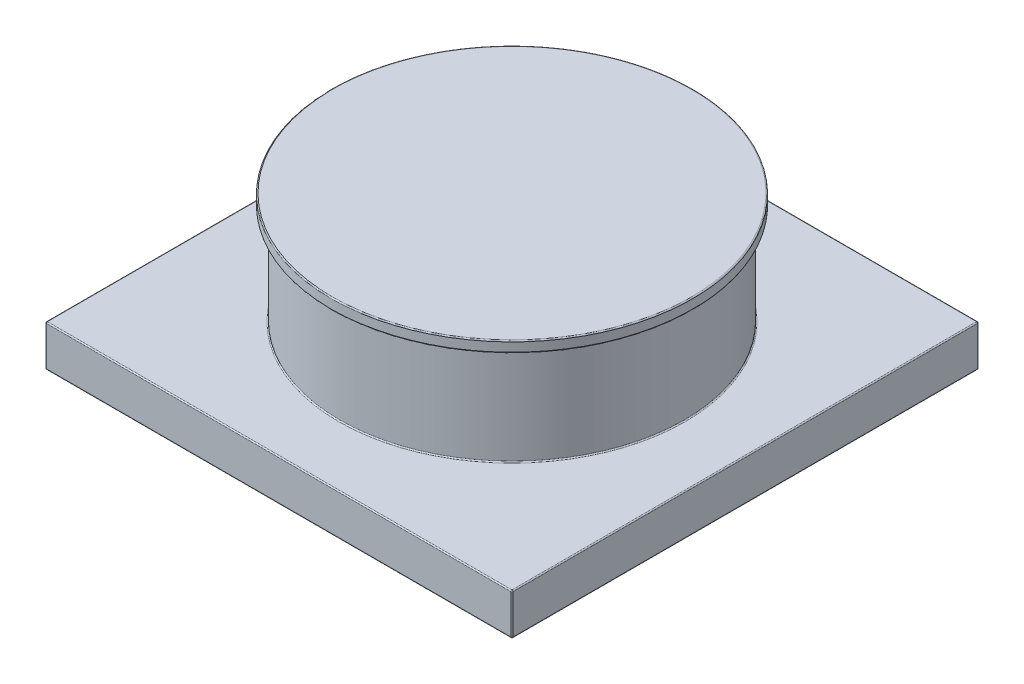
ISO-10303-21;
HEADER;
FILE_DESCRIPTION(('STEP AP214'),'2;1');
FILE_NAME('part.step','',(''),(''),'','','');
FILE_SCHEMA(('AUTOMOTIVE_DESIGN { 1 0 10303 214 1 1 1 1 }'));
ENDSEC;
DATA;
#1=APPLICATION_CONTEXT('core data for automotive mechanical design processes');
#2=APPLICATION_PROTOCOL_DEFINITION('international standard','automotive_design',2000,#1);
#3=PRODUCT_CONTEXT('',#1,'mechanical');
#4=PRODUCT('Part','Part','',(#3));
#5=PRODUCT_RELATED_PRODUCT_CATEGORY('part','',(#4));
#6=PRODUCT_DEFINITION_FORMATION('','',#4);
#7=PRODUCT_DEFINITION_CONTEXT('part definition',#1,'design');
#8=PRODUCT_DEFINITION('design','',#6,#7);
#9=PRODUCT_DEFINITION_SHAPE('','',#8);
#10=(LENGTH_UNIT() NAMED_UNIT(*) SI_UNIT(.MILLI.,.METRE.));
#11=(NAMED_UNIT(*) PLANE_ANGLE_UNIT() SI_UNIT($,.RADIAN.));
#12=(NAMED_UNIT(*) SI_UNIT($,.STERADIAN.) SOLID_ANGLE_UNIT());
#13=UNCERTAINTY_MEASURE_WITH_UNIT(LENGTH_MEASURE(1.E-05),#10,'distance_accuracy_value','');
#14=(GEOMETRIC_REPRESENTATION_CONTEXT(3) GLOBAL_UNCERTAINTY_ASSIGNED_CONTEXT((#13)) GLOBAL_UNIT_ASSIGNED_CONTEXT((#10,
#11,#12)) REPRESENTATION_CONTEXT('',''));
#15=CARTESIAN_POINT('',(0.,0.,0.));
#16=DIRECTION('',(0.,0.,1.));
#17=DIRECTION('',(1.,0.,0.));
#18=AXIS2_PLACEMENT_3D('',#15,#16,#17);
#19=CARTESIAN_POINT('',(1050.,687.,-1050.));
#20=DIRECTION('',(0.,-1.,0.));
#21=DIRECTION('',(0.,0.,-1.));
#22=AXIS2_PLACEMENT_3D('',#19,#20,#21);
#23=CYLINDRICAL_SURFACE('',#22,775.);
#24=CARTESIAN_POINT('',(1050.,191.,-1050.));
#25=DIRECTION('',(0.,-1.,0.));
#26=DIRECTION('',(0.,0.,-1.));
#27=AXIS2_PLACEMENT_3D('',#24,#25,#26);
#28=CIRCLE('',#27,775.);
#29=CARTESIAN_POINT('',(1050.,191.,-1825.));
#30=VERTEX_POINT('',#29);
#31=EDGE_CURVE('E284',#30,#30,#28,.F.);
#32=ORIENTED_EDGE('',*,*,#31,.T.);
#33=EDGE_LOOP('',(#32));
#34=FACE_BOUND('',#33,.T.);
#35=CARTESIAN_POINT('',(1050.,637.,-1050.));
#36=DIRECTION('',(0.,1.,0.));
#37=DIRECTION('',(0.,0.,1.));
#38=AXIS2_PLACEMENT_3D('',#35,#36,#37);
#39=CIRCLE('',#38,775.);
#40=CARTESIAN_POINT('',(1050.,637.,-275.));
#41=VERTEX_POINT('',#40);
#42=EDGE_CURVE('E148',#41,#41,#39,.T.);
#43=ORIENTED_EDGE('',*,*,#42,.F.);
#44=EDGE_LOOP('',(#43));
#45=FACE_BOUND('',#44,.T.);
#46=ADVANCED_FACE('F33',(#34,#45),#23,.T.);
#47=CARTESIAN_POINT('',(0.,186.,-2100.));
#48=DIRECTION('',(0.,-1.,0.));
#49=DIRECTION('',(0.,0.,-1.));
#50=AXIS2_PLACEMENT_3D('',#47,#48,#49);
#51=PLANE('',#50);
#52=DIRECTION('',(1.,0.,0.));
#53=VECTOR('',#52,1.);
#54=CARTESIAN_POINT('',(0.,186.,-4.99999999999989));
#55=LINE('',#54,#53);
#56=CARTESIAN_POINT('',(5.,186.,-4.99999999999989));
#57=VERTEX_POINT('',#56);
#58=CARTESIAN_POINT('',(2095.,186.,-4.99999999999989));
#59=VERTEX_POINT('',#58);
#60=EDGE_CURVE('E58',#57,#59,#55,.T.);
#61=ORIENTED_EDGE('',*,*,#60,.T.);
#62=DIRECTION('',(0.,0.,-1.));
#63=VECTOR('',#62,1.);
#64=CARTESIAN_POINT('',(2095.,186.,-2100.));
#65=LINE('',#64,#63);
#66=CARTESIAN_POINT('',(2095.,186.,-2095.));
#67=VERTEX_POINT('',#66);
#68=EDGE_CURVE('E282',#59,#67,#65,.T.);
#69=ORIENTED_EDGE('',*,*,#68,.T.);
#70=DIRECTION('',(-1.,0.,0.));
#71=VECTOR('',#70,1.);
#72=CARTESIAN_POINT('',(0.,186.,-2095.));
#73=LINE('',#72,#71);
#74=CARTESIAN_POINT('',(5.,186.,-2095.));
#75=VERTEX_POINT('',#74);
#76=EDGE_CURVE('E50',#67,#75,#73,.T.);
#77=ORIENTED_EDGE('',*,*,#76,.T.);
#78=DIRECTION('',(0.,0.,1.));
#79=VECTOR('',#78,1.);
#80=CARTESIAN_POINT('',(5.,186.,-2100.));
#81=LINE('',#80,#79);
#82=EDGE_CURVE('E278',#75,#57,#81,.T.);
#83=ORIENTED_EDGE('',*,*,#82,.T.);
#84=EDGE_LOOP('',(#61,#69,#77,#83));
#85=FACE_BOUND('',#84,.T.);
#86=CARTESIAN_POINT('',(1050.,186.,-1050.));
#87=DIRECTION('',(0.,-1.,0.));
#88=DIRECTION('',(0.,0.,-1.));
#89=AXIS2_PLACEMENT_3D('',#86,#87,#88);
#90=CIRCLE('',#89,780.);
#91=CARTESIAN_POINT('',(1050.,186.,-1830.));
#92=VERTEX_POINT('',#91);
#93=EDGE_CURVE('E275',#92,#92,#90,.T.);
#94=ORIENTED_EDGE('',*,*,#93,.T.);
#95=EDGE_LOOP('',(#94));
#96=FACE_BOUND('',#95,.T.);
#97=ADVANCED_FACE('F362',(#85,#96),#51,.F.);
#98=CARTESIAN_POINT('',(0.,186.,0.));
#99=DIRECTION('',(1.,0.,0.));
#100=DIRECTION('',(0.,0.,-1.));
#101=AXIS2_PLACEMENT_3D('',#98,#99,#100);
#102=PLANE('',#101);
#103=DIRECTION('',(0.,-1.,0.));
#104=VECTOR('',#103,1.);
#105=CARTESIAN_POINT('',(0.,186.,-2095.));
#106=LINE('',#105,#104);
#107=CARTESIAN_POINT('',(0.,181.,-2095.));
#108=VERTEX_POINT('',#107);
#109=CARTESIAN_POINT('',(0.,5.,-2095.));
#110=VERTEX_POINT('',#109);
#111=EDGE_CURVE('E136',#108,#110,#106,.T.);
#112=ORIENTED_EDGE('',*,*,#111,.T.);
#113=DIRECTION('',(0.,0.,1.));
#114=VECTOR('',#113,1.);
#115=CARTESIAN_POINT('',(0.,5.,0.));
#116=LINE('',#115,#114);
#117=CARTESIAN_POINT('',(0.,5.,-5.));
#118=VERTEX_POINT('',#117);
#119=EDGE_CURVE('E132',#110,#118,#116,.T.);
#120=ORIENTED_EDGE('',*,*,#119,.T.);
#121=DIRECTION('',(0.,-1.,0.));
#122=VECTOR('',#121,1.);
#123=CARTESIAN_POINT('',(0.,186.,-5.));
#124=LINE('',#123,#122);
#125=CARTESIAN_POINT('',(0.,181.,-5.));
#126=VERTEX_POINT('',#125);
#127=EDGE_CURVE('E126',#118,#126,#124,.F.);
#128=ORIENTED_EDGE('',*,*,#127,.T.);
#129=DIRECTION('',(0.,0.,1.));
#130=VECTOR('',#129,1.);
#131=CARTESIAN_POINT('',(0.,181.,0.));
#132=LINE('',#131,#130);
#133=EDGE_CURVE('E129',#126,#108,#132,.F.);
#134=ORIENTED_EDGE('',*,*,#133,.T.);
#135=EDGE_LOOP('',(#112,#120,#128,#134));
#136=FACE_BOUND('',#135,.T.);
#137=ADVANCED_FACE('F128',(#136),#102,.F.);
#138=CARTESIAN_POINT('',(0.,186.,0.));
#139=DIRECTION('',(0.,0.,-1.));
#140=DIRECTION('',(-1.,0.,0.));
#141=AXIS2_PLACEMENT_3D('',#138,#139,#140);
#142=PLANE('',#141);
#143=DIRECTION('',(1.,0.,0.));
#144=VECTOR('',#143,1.);
#145=CARTESIAN_POINT('',(0.,181.,0.));
#146=LINE('',#145,#144);
#147=CARTESIAN_POINT('',(2095.,181.,0.));
#148=VERTEX_POINT('',#147);
#149=CARTESIAN_POINT('',(5.,181.,0.));
#150=VERTEX_POINT('',#149);
#151=EDGE_CURVE('E250',#148,#150,#146,.F.);
#152=ORIENTED_EDGE('',*,*,#151,.T.);
#153=DIRECTION('',(0.,-1.,0.));
#154=VECTOR('',#153,1.);
#155=CARTESIAN_POINT('',(5.,186.,0.));
#156=LINE('',#155,#154);
#157=CARTESIAN_POINT('',(5.,5.,0.));
#158=VERTEX_POINT('',#157);
#159=EDGE_CURVE('E160',#150,#158,#156,.T.);
#160=ORIENTED_EDGE('',*,*,#159,.T.);
#161=DIRECTION('',(1.,0.,0.));
#162=VECTOR('',#161,1.);
#163=CARTESIAN_POINT('',(2100.,5.,0.));
#164=LINE('',#163,#162);
#165=CARTESIAN_POINT('',(2095.,5.,0.));
#166=VERTEX_POINT('',#165);
#167=EDGE_CURVE('E254',#158,#166,#164,.T.);
#168=ORIENTED_EDGE('',*,*,#167,.T.);
#169=DIRECTION('',(0.,-1.,0.));
#170=VECTOR('',#169,1.);
#171=CARTESIAN_POINT('',(2095.,186.,0.));
#172=LINE('',#171,#170);
#173=EDGE_CURVE('E252',#166,#148,#172,.F.);
#174=ORIENTED_EDGE('',*,*,#173,.T.);
#175=EDGE_LOOP('',(#152,#160,#168,#174));
#176=FACE_BOUND('',#175,.T.);
#177=ADVANCED_FACE('F335',(#176),#142,.F.);
#178=CARTESIAN_POINT('',(2100.,186.,0.));
#179=DIRECTION('',(-1.,0.,0.));
#180=DIRECTION('',(0.,0.,1.));
#181=AXIS2_PLACEMENT_3D('',#178,#179,#180);
#182=PLANE('',#181);
#183=DIRECTION('',(0.,0.,-1.));
#184=VECTOR('',#183,1.);
#185=CARTESIAN_POINT('',(2100.,5.,-2100.));
#186=LINE('',#185,#184);
#187=CARTESIAN_POINT('',(2100.,5.,-5.));
#188=VERTEX_POINT('',#187);
#189=CARTESIAN_POINT('',(2100.,5.,-2095.));
#190=VERTEX_POINT('',#189);
#191=EDGE_CURVE('E270',#188,#190,#186,.T.);
#192=ORIENTED_EDGE('',*,*,#191,.T.);
#193=DIRECTION('',(0.,-1.,0.));
#194=VECTOR('',#193,1.);
#195=CARTESIAN_POINT('',(2100.,186.,-2095.));
#196=LINE('',#195,#194);
#197=CARTESIAN_POINT('',(2100.,181.,-2095.));
#198=VERTEX_POINT('',#197);
#199=EDGE_CURVE('E272',#190,#198,#196,.F.);
#200=ORIENTED_EDGE('',*,*,#199,.T.);
#201=DIRECTION('',(0.,0.,-1.));
#202=VECTOR('',#201,1.);
#203=CARTESIAN_POINT('',(2100.,181.,0.));
#204=LINE('',#203,#202);
#205=CARTESIAN_POINT('',(2100.,181.,-5.));
#206=VERTEX_POINT('',#205);
#207=EDGE_CURVE('E266',#198,#206,#204,.F.);
#208=ORIENTED_EDGE('',*,*,#207,.T.);
#209=DIRECTION('',(0.,-1.,0.));
#210=VECTOR('',#209,1.);
#211=CARTESIAN_POINT('',(2100.,186.,-5.));
#212=LINE('',#211,#210);
#213=EDGE_CURVE('E268',#206,#188,#212,.T.);
#214=ORIENTED_EDGE('',*,*,#213,.T.);
#215=EDGE_LOOP('',(#192,#200,#208,#214));
#216=FACE_BOUND('',#215,.T.);
#217=ADVANCED_FACE('F346',(#216),#182,.F.);
#218=CARTESIAN_POINT('',(0.,186.,-2100.));
#219=DIRECTION('',(0.,0.,1.));
#220=DIRECTION('',(1.,0.,0.));
#221=AXIS2_PLACEMENT_3D('',#218,#219,#220);
#222=PLANE('',#221);
#223=DIRECTION('',(-1.,0.,0.));
#224=VECTOR('',#223,1.);
#225=CARTESIAN_POINT('',(0.,5.,-2100.));
#226=LINE('',#225,#224);
#227=CARTESIAN_POINT('',(2095.,5.,-2100.));
#228=VERTEX_POINT('',#227);
#229=CARTESIAN_POINT('',(5.,5.,-2100.));
#230=VERTEX_POINT('',#229);
#231=EDGE_CURVE('E261',#228,#230,#226,.T.);
#232=ORIENTED_EDGE('',*,*,#231,.T.);
#233=DIRECTION('',(0.,-1.,0.));
#234=VECTOR('',#233,1.);
#235=CARTESIAN_POINT('',(5.,186.,-2100.));
#236=LINE('',#235,#234);
#237=CARTESIAN_POINT('',(5.,181.,-2100.));
#238=VERTEX_POINT('',#237);
#239=EDGE_CURVE('E263',#230,#238,#236,.F.);
#240=ORIENTED_EDGE('',*,*,#239,.T.);
#241=DIRECTION('',(-1.,0.,0.));
#242=VECTOR('',#241,1.);
#243=CARTESIAN_POINT('',(0.,181.,-2100.));
#244=LINE('',#243,#242);
#245=CARTESIAN_POINT('',(2095.,181.,-2100.));
#246=VERTEX_POINT('',#245);
#247=EDGE_CURVE('E257',#238,#246,#244,.F.);
#248=ORIENTED_EDGE('',*,*,#247,.T.);
#249=DIRECTION('',(0.,-1.,0.));
#250=VECTOR('',#249,1.);
#251=CARTESIAN_POINT('',(2095.,186.,-2100.));
#252=LINE('',#251,#250);
#253=EDGE_CURVE('E259',#246,#228,#252,.T.);
#254=ORIENTED_EDGE('',*,*,#253,.T.);
#255=EDGE_LOOP('',(#232,#240,#248,#254));
#256=FACE_BOUND('',#255,.T.);
#257=ADVANCED_FACE('F372',(#256),#222,.F.);
#258=CARTESIAN_POINT('',(0.,0.,-2100.));
#259=DIRECTION('',(0.,-1.,0.));
#260=DIRECTION('',(0.,0.,-1.));
#261=AXIS2_PLACEMENT_3D('',#258,#259,#260);
#262=PLANE('',#261);
#263=DIRECTION('',(1.,0.,0.));
#264=VECTOR('',#263,1.);
#265=CARTESIAN_POINT('',(0.,0.,-5.));
#266=LINE('',#265,#264);
#267=CARTESIAN_POINT('',(2095.,0.,-5.));
#268=VERTEX_POINT('',#267);
#269=CARTESIAN_POINT('',(5.,0.,-5.));
#270=VERTEX_POINT('',#269);
#271=EDGE_CURVE('E241',#268,#270,#266,.F.);
#272=ORIENTED_EDGE('',*,*,#271,.T.);
#273=DIRECTION('',(0.,0.,1.));
#274=VECTOR('',#273,1.);
#275=CARTESIAN_POINT('',(5.,0.,-2100.));
#276=LINE('',#275,#274);
#277=CARTESIAN_POINT('',(5.,0.,-2095.));
#278=VERTEX_POINT('',#277);
#279=EDGE_CURVE('E247',#270,#278,#276,.F.);
#280=ORIENTED_EDGE('',*,*,#279,.T.);
#281=DIRECTION('',(-1.,0.,0.));
#282=VECTOR('',#281,1.);
#283=CARTESIAN_POINT('',(2100.,0.,-2095.));
#284=LINE('',#283,#282);
#285=CARTESIAN_POINT('',(2095.,0.,-2095.));
#286=VERTEX_POINT('',#285);
#287=EDGE_CURVE('E245',#278,#286,#284,.F.);
#288=ORIENTED_EDGE('',*,*,#287,.T.);
#289=DIRECTION('',(0.,0.,-1.));
#290=VECTOR('',#289,1.);
#291=CARTESIAN_POINT('',(2095.,0.,0.));
#292=LINE('',#291,#290);
#293=EDGE_CURVE('E243',#286,#268,#292,.F.);
#294=ORIENTED_EDGE('',*,*,#293,.T.);
#295=EDGE_LOOP('',(#272,#280,#288,#294));
#296=FACE_BOUND('',#295,.T.);
#297=CARTESIAN_POINT('',(1556.65203224213,0.,-1500.));
#298=DIRECTION('',(0.,-1.,0.));
#299=DIRECTION('',(0.,0.,-1.));
#300=AXIS2_PLACEMENT_3D('',#297,#298,#299);
#301=CIRCLE('',#300,12.5000000000003);
#302=CARTESIAN_POINT('',(1556.65203224213,0.,-1512.5));
#303=VERTEX_POINT('',#302);
#304=EDGE_CURVE('E206',#303,#303,#301,.T.);
#305=ORIENTED_EDGE('',*,*,#304,.F.);
#306=EDGE_LOOP('',(#305));
#307=FACE_BOUND('',#306,.T.);
#308=CARTESIAN_POINT('',(546.652032242126,0.,-1500.));
#309=DIRECTION('',(0.,-1.,0.));
#310=DIRECTION('',(0.,0.,-1.));
#311=AXIS2_PLACEMENT_3D('',#308,#309,#310);
#312=CIRCLE('',#311,12.5);
#313=CARTESIAN_POINT('',(546.652032242126,0.,-1512.5));
#314=VERTEX_POINT('',#313);
#315=EDGE_CURVE('E217',#314,#314,#312,.T.);
#316=ORIENTED_EDGE('',*,*,#315,.F.);
#317=EDGE_LOOP('',(#316));
#318=FACE_BOUND('',#317,.T.);
#319=CARTESIAN_POINT('',(1556.65203224213,0.,-600.));
#320=DIRECTION('',(0.,-1.,0.));
#321=DIRECTION('',(0.,0.,-1.));
#322=AXIS2_PLACEMENT_3D('',#319,#320,#321);
#323=CIRCLE('',#322,12.5000000000002);
#324=CARTESIAN_POINT('',(1556.65203224213,0.,-612.5));
#325=VERTEX_POINT('',#324);
#326=EDGE_CURVE('E223',#325,#325,#323,.T.);
#327=ORIENTED_EDGE('',*,*,#326,.F.);
#328=EDGE_LOOP('',(#327));
#329=FACE_BOUND('',#328,.T.);
#330=CARTESIAN_POINT('',(546.652032242126,0.,-600.));
#331=DIRECTION('',(0.,-1.,0.));
#332=DIRECTION('',(0.,0.,-1.));
#333=AXIS2_PLACEMENT_3D('',#330,#331,#332);
#334=CIRCLE('',#333,12.5);
#335=CARTESIAN_POINT('',(546.652032242126,0.,-612.5));
#336=VERTEX_POINT('',#335);
#337=EDGE_CURVE('E229',#336,#336,#334,.T.);
#338=ORIENTED_EDGE('',*,*,#337,.F.);
#339=EDGE_LOOP('',(#338));
#340=FACE_BOUND('',#339,.T.);
#341=ADVANCED_FACE('F320',(#296,#307,#318,#329,#340),#262,.T.);
#342=CARTESIAN_POINT('',(1050.,637.,-1050.));
#343=DIRECTION('',(0.,1.,0.));
#344=DIRECTION('',(0.,0.,1.));
#345=AXIS2_PLACEMENT_3D('',#342,#343,#344);
#346=PLANE('',#345);
#347=CARTESIAN_POINT('',(1050.,637.,-1050.));
#348=DIRECTION('',(0.,1.,0.));
#349=DIRECTION('',(0.,0.,1.));
#350=AXIS2_PLACEMENT_3D('',#347,#348,#349);
#351=CIRCLE('',#350,808.341747170224);
#352=CARTESIAN_POINT('',(1050.,637.,-241.658252829776));
#353=VERTEX_POINT('',#352);
#354=EDGE_CURVE('E42',#353,#353,#351,.F.);
#355=ORIENTED_EDGE('',*,*,#354,.T.);
#356=EDGE_LOOP('',(#355));
#357=FACE_BOUND('',#356,.T.);
#358=ORIENTED_EDGE('',*,*,#42,.T.);
#359=EDGE_LOOP('',(#358));
#360=FACE_BOUND('',#359,.T.);
#361=ADVANCED_FACE('F379',(#357,#360),#346,.F.);
#362=CARTESIAN_POINT('',(1050.,637.,-1050.));
#363=DIRECTION('',(0.,1.,0.));
#364=DIRECTION('',(0.,0.,1.));
#365=AXIS2_PLACEMENT_3D('',#362,#363,#364);
#366=CYLINDRICAL_SURFACE('',#365,813.341747170224);
#367=CARTESIAN_POINT('',(1050.,642.,-1050.));
#368=DIRECTION('',(0.,1.,0.));
#369=DIRECTION('',(0.,0.,1.));
#370=AXIS2_PLACEMENT_3D('',#367,#368,#369);
#371=CIRCLE('',#370,813.341747170224);
#372=CARTESIAN_POINT('',(1050.,642.,-236.658252829776));
#373=VERTEX_POINT('',#372);
#374=EDGE_CURVE('E290',#373,#373,#371,.T.);
#375=ORIENTED_EDGE('',*,*,#374,.T.);
#376=EDGE_LOOP('',(#375));
#377=FACE_BOUND('',#376,.T.);
#378=CARTESIAN_POINT('',(1050.,682.,-1050.));
#379=DIRECTION('',(0.,1.,0.));
#380=DIRECTION('',(0.,0.,1.));
#381=AXIS2_PLACEMENT_3D('',#378,#379,#380);
#382=CIRCLE('',#381,813.341747170224);
#383=CARTESIAN_POINT('',(1050.,682.,-236.658252829776));
#384=VERTEX_POINT('',#383);
#385=EDGE_CURVE('E287',#384,#384,#382,.F.);
#386=ORIENTED_EDGE('',*,*,#385,.T.);
#387=EDGE_LOOP('',(#386));
#388=FACE_BOUND('',#387,.T.);
#389=ADVANCED_FACE('F395',(#377,#388),#366,.T.);
#390=CARTESIAN_POINT('',(1050.,687.,-1050.));
#391=DIRECTION('',(0.,1.,0.));
#392=DIRECTION('',(0.,0.,1.));
#393=AXIS2_PLACEMENT_3D('',#390,#391,#392);
#394=PLANE('',#393);
#395=CARTESIAN_POINT('',(1050.,687.,-1050.));
#396=DIRECTION('',(0.,1.,0.));
#397=DIRECTION('',(0.,0.,1.));
#398=AXIS2_PLACEMENT_3D('',#395,#396,#397);
#399=CIRCLE('',#398,808.341747170224);
#400=CARTESIAN_POINT('',(1050.,687.,-241.658252829776));
#401=VERTEX_POINT('',#400);
#402=EDGE_CURVE('E11',#401,#401,#399,.T.);
#403=ORIENTED_EDGE('',*,*,#402,.T.);
#404=EDGE_LOOP('',(#403));
#405=FACE_BOUND('',#404,.T.);
#406=ADVANCED_FACE('F391',(#405),#394,.T.);
#407=CARTESIAN_POINT('',(546.652032242126,10.,-600.));
#408=DIRECTION('',(0.,-1.,0.));
#409=DIRECTION('',(0.,0.,-1.));
#410=AXIS2_PLACEMENT_3D('',#407,#408,#409);
#411=CYLINDRICAL_SURFACE('',#410,12.5);
#412=CARTESIAN_POINT('',(546.652032242126,10.,-600.));
#413=DIRECTION('',(0.,-1.,0.));
#414=DIRECTION('',(0.,0.,-1.));
#415=AXIS2_PLACEMENT_3D('',#412,#413,#414);
#416=CIRCLE('',#415,12.5);
#417=CARTESIAN_POINT('',(546.652032242126,10.,-612.5));
#418=VERTEX_POINT('',#417);
#419=EDGE_CURVE('E232',#418,#418,#416,.T.);
#420=ORIENTED_EDGE('',*,*,#419,.F.);
#421=EDGE_LOOP('',(#420));
#422=FACE_BOUND('',#421,.T.);
#423=ORIENTED_EDGE('',*,*,#337,.T.);
#424=EDGE_LOOP('',(#423));
#425=FACE_BOUND('',#424,.T.);
#426=ADVANCED_FACE('F394',(#422,#425),#411,.F.);
#427=CARTESIAN_POINT('',(546.652032242126,10.,-600.));
#428=DIRECTION('',(0.,-1.,0.));
#429=DIRECTION('',(0.,0.,-1.));
#430=AXIS2_PLACEMENT_3D('',#427,#428,#429);
#431=PLANE('',#430);
#432=ORIENTED_EDGE('',*,*,#419,.T.);
#433=EDGE_LOOP('',(#432));
#434=FACE_BOUND('',#433,.T.);
#435=ADVANCED_FACE('F405',(#434),#431,.T.);
#436=CARTESIAN_POINT('',(1556.65203224213,10.,-600.));
#437=DIRECTION('',(0.,-1.,0.));
#438=DIRECTION('',(0.,0.,-1.));
#439=AXIS2_PLACEMENT_3D('',#436,#437,#438);
#440=CYLINDRICAL_SURFACE('',#439,12.5000000000002);
#441=CARTESIAN_POINT('',(1556.65203224213,10.,-600.));
#442=DIRECTION('',(0.,-1.,0.));
#443=DIRECTION('',(0.,0.,-1.));
#444=AXIS2_PLACEMENT_3D('',#441,#442,#443);
#445=CIRCLE('',#444,12.5000000000002);
#446=CARTESIAN_POINT('',(1556.65203224213,10.,-612.5));
#447=VERTEX_POINT('',#446);
#448=EDGE_CURVE('E226',#447,#447,#445,.T.);
#449=ORIENTED_EDGE('',*,*,#448,.F.);
#450=EDGE_LOOP('',(#449));
#451=FACE_BOUND('',#450,.T.);
#452=ORIENTED_EDGE('',*,*,#326,.T.);
#453=EDGE_LOOP('',(#452));
#454=FACE_BOUND('',#453,.T.);
#455=ADVANCED_FACE('F409',(#451,#454),#440,.F.);
#456=CARTESIAN_POINT('',(1556.65203224213,10.,-600.));
#457=DIRECTION('',(0.,-1.,0.));
#458=DIRECTION('',(0.,0.,-1.));
#459=AXIS2_PLACEMENT_3D('',#456,#457,#458);
#460=PLANE('',#459);
#461=ORIENTED_EDGE('',*,*,#448,.T.);
#462=EDGE_LOOP('',(#461));
#463=FACE_BOUND('',#462,.T.);
#464=ADVANCED_FACE('F413',(#463),#460,.T.);
#465=CARTESIAN_POINT('',(546.652032242126,10.,-1500.));
#466=DIRECTION('',(0.,-1.,0.));
#467=DIRECTION('',(0.,0.,-1.));
#468=AXIS2_PLACEMENT_3D('',#465,#466,#467);
#469=CYLINDRICAL_SURFACE('',#468,12.5);
#470=CARTESIAN_POINT('',(546.652032242126,10.,-1500.));
#471=DIRECTION('',(0.,-1.,0.));
#472=DIRECTION('',(0.,0.,-1.));
#473=AXIS2_PLACEMENT_3D('',#470,#471,#472);
#474=CIRCLE('',#473,12.5);
#475=CARTESIAN_POINT('',(546.652032242126,10.,-1512.5));
#476=VERTEX_POINT('',#475);
#477=EDGE_CURVE('E220',#476,#476,#474,.T.);
#478=ORIENTED_EDGE('',*,*,#477,.F.);
#479=EDGE_LOOP('',(#478));
#480=FACE_BOUND('',#479,.T.);
#481=ORIENTED_EDGE('',*,*,#315,.T.);
#482=EDGE_LOOP('',(#481));
#483=FACE_BOUND('',#482,.T.);
#484=ADVANCED_FACE('F417',(#480,#483),#469,.F.);
#485=CARTESIAN_POINT('',(546.652032242126,10.,-1500.));
#486=DIRECTION('',(0.,-1.,0.));
#487=DIRECTION('',(0.,0.,-1.));
#488=AXIS2_PLACEMENT_3D('',#485,#486,#487);
#489=PLANE('',#488);
#490=ORIENTED_EDGE('',*,*,#477,.T.);
#491=EDGE_LOOP('',(#490));
#492=FACE_BOUND('',#491,.T.);
#493=ADVANCED_FACE('F421',(#492),#489,.T.);
#494=CARTESIAN_POINT('',(1556.65203224213,10.,-1500.));
#495=DIRECTION('',(0.,-1.,0.));
#496=DIRECTION('',(0.,0.,-1.));
#497=AXIS2_PLACEMENT_3D('',#494,#495,#496);
#498=CYLINDRICAL_SURFACE('',#497,12.5000000000003);
#499=CARTESIAN_POINT('',(1556.65203224213,10.,-1500.));
#500=DIRECTION('',(0.,-1.,0.));
#501=DIRECTION('',(0.,0.,-1.));
#502=AXIS2_PLACEMENT_3D('',#499,#500,#501);
#503=CIRCLE('',#502,12.5000000000003);
#504=CARTESIAN_POINT('',(1556.65203224213,10.,-1512.5));
#505=VERTEX_POINT('',#504);
#506=EDGE_CURVE('E212',#505,#505,#503,.T.);
#507=ORIENTED_EDGE('',*,*,#506,.F.);
#508=EDGE_LOOP('',(#507));
#509=FACE_BOUND('',#508,.T.);
#510=ORIENTED_EDGE('',*,*,#304,.T.);
#511=EDGE_LOOP('',(#510));
#512=FACE_BOUND('',#511,.T.);
#513=ADVANCED_FACE('F425',(#509,#512),#498,.F.);
#514=CARTESIAN_POINT('',(1556.65203224213,10.,-1500.));
#515=DIRECTION('',(0.,-1.,0.));
#516=DIRECTION('',(0.,0.,-1.));
#517=AXIS2_PLACEMENT_3D('',#514,#515,#516);
#518=PLANE('',#517);
#519=ORIENTED_EDGE('',*,*,#506,.T.);
#520=EDGE_LOOP('',(#519));
#521=FACE_BOUND('',#520,.T.);
#522=ADVANCED_FACE('F429',(#521),#518,.T.);
#523=CARTESIAN_POINT('',(2095.,181.,-2100.));
#524=DIRECTION('',(0.,0.,-1.));
#525=DIRECTION('',(-1.,0.,0.));
#526=AXIS2_PLACEMENT_3D('',#523,#524,#525);
#527=CYLINDRICAL_SURFACE('',#526,5.);
#528=CARTESIAN_POINT('',(2095.,181.,-2095.));
#529=DIRECTION('',(0.,0.,-1.));
#530=DIRECTION('',(-1.,0.,0.));
#531=AXIS2_PLACEMENT_3D('',#528,#529,#530);
#532=CIRCLE('',#531,5.);
#533=EDGE_CURVE('E37',#67,#198,#532,.T.);
#534=ORIENTED_EDGE('',*,*,#533,.F.);
#535=ORIENTED_EDGE('',*,*,#68,.F.);
#536=CARTESIAN_POINT('',(2095.,181.,-5.));
#537=DIRECTION('',(0.,0.,1.));
#538=DIRECTION('',(0.,-1.,0.));
#539=AXIS2_PLACEMENT_3D('',#536,#537,#538);
#540=CIRCLE('',#539,5.);
#541=EDGE_CURVE('E199',#206,#59,#540,.T.);
#542=ORIENTED_EDGE('',*,*,#541,.F.);
#543=ORIENTED_EDGE('',*,*,#207,.F.);
#544=EDGE_LOOP('',(#534,#535,#542,#543));
#545=FACE_BOUND('',#544,.T.);
#546=ADVANCED_FACE('F361',(#545),#527,.T.);
#547=CARTESIAN_POINT('',(2095.,181.,-2095.));
#548=DIRECTION('',(0.,0.,1.));
#549=DIRECTION('',(1.,0.,0.));
#550=AXIS2_PLACEMENT_3D('',#547,#548,#549);
#551=SPHERICAL_SURFACE('',#550,5.);
#552=CARTESIAN_POINT('',(2095.,181.,-2095.));
#553=DIRECTION('',(1.,0.,0.));
#554=DIRECTION('',(0.,1.,0.));
#555=AXIS2_PLACEMENT_3D('',#552,#553,#554);
#556=CIRCLE('',#555,5.);
#557=EDGE_CURVE('E196',#67,#246,#556,.F.);
#558=ORIENTED_EDGE('',*,*,#557,.F.);
#559=ORIENTED_EDGE('',*,*,#533,.T.);
#560=CARTESIAN_POINT('',(2095.,181.,-2095.));
#561=DIRECTION('',(0.,1.,0.));
#562=DIRECTION('',(0.,0.,1.));
#563=AXIS2_PLACEMENT_3D('',#560,#561,#562);
#564=CIRCLE('',#563,5.);
#565=EDGE_CURVE('E198',#246,#198,#564,.F.);
#566=ORIENTED_EDGE('',*,*,#565,.F.);
#567=EDGE_LOOP('',(#558,#559,#566));
#568=FACE_BOUND('',#567,.T.);
#569=ADVANCED_FACE('F358',(#568),#551,.T.);
#570=CARTESIAN_POINT('',(2095.,181.,-5.));
#571=DIRECTION('',(0.,0.,1.));
#572=DIRECTION('',(1.,0.,0.));
#573=AXIS2_PLACEMENT_3D('',#570,#571,#572);
#574=SPHERICAL_SURFACE('',#573,5.);
#575=CARTESIAN_POINT('',(2095.,181.,-5.));
#576=DIRECTION('',(0.,1.,0.));
#577=DIRECTION('',(0.,0.,1.));
#578=AXIS2_PLACEMENT_3D('',#575,#576,#577);
#579=CIRCLE('',#578,5.);
#580=EDGE_CURVE('E190',#206,#148,#579,.F.);
#581=ORIENTED_EDGE('',*,*,#580,.F.);
#582=ORIENTED_EDGE('',*,*,#541,.T.);
#583=CARTESIAN_POINT('',(2095.,181.,-4.99999999999989));
#584=DIRECTION('',(1.,0.,0.));
#585=DIRECTION('',(0.,0.,-1.));
#586=AXIS2_PLACEMENT_3D('',#583,#584,#585);
#587=CIRCLE('',#586,5.);
#588=EDGE_CURVE('E193',#148,#59,#587,.F.);
#589=ORIENTED_EDGE('',*,*,#588,.F.);
#590=EDGE_LOOP('',(#581,#582,#589));
#591=FACE_BOUND('',#590,.T.);
#592=ADVANCED_FACE('F339',(#591),#574,.T.);
#593=CARTESIAN_POINT('',(2095.,186.,-2095.));
#594=DIRECTION('',(0.,-1.,0.));
#595=DIRECTION('',(0.,0.,-1.));
#596=AXIS2_PLACEMENT_3D('',#593,#594,#595);
#597=CYLINDRICAL_SURFACE('',#596,5.);
#598=ORIENTED_EDGE('',*,*,#565,.T.);
#599=ORIENTED_EDGE('',*,*,#199,.F.);
#600=CARTESIAN_POINT('',(2095.,5.,-2095.));
#601=DIRECTION('',(0.,-1.,0.));
#602=DIRECTION('',(0.,0.,-1.));
#603=AXIS2_PLACEMENT_3D('',#600,#601,#602);
#604=CIRCLE('',#603,5.);
#605=EDGE_CURVE('E184',#228,#190,#604,.T.);
#606=ORIENTED_EDGE('',*,*,#605,.F.);
#607=ORIENTED_EDGE('',*,*,#253,.F.);
#608=EDGE_LOOP('',(#598,#599,#606,#607));
#609=FACE_BOUND('',#608,.T.);
#610=ADVANCED_FACE('F357',(#609),#597,.T.);
#611=CARTESIAN_POINT('',(0.,181.,-2095.));
#612=DIRECTION('',(-1.,0.,0.));
#613=DIRECTION('',(0.,0.,1.));
#614=AXIS2_PLACEMENT_3D('',#611,#612,#613);
#615=CYLINDRICAL_SURFACE('',#614,5.);
#616=ORIENTED_EDGE('',*,*,#557,.T.);
#617=ORIENTED_EDGE('',*,*,#247,.F.);
#618=CARTESIAN_POINT('',(5.,181.,-2095.));
#619=DIRECTION('',(-1.,0.,0.));
#620=DIRECTION('',(0.,0.,1.));
#621=AXIS2_PLACEMENT_3D('',#618,#619,#620);
#622=CIRCLE('',#621,5.);
#623=EDGE_CURVE('E181',#75,#238,#622,.T.);
#624=ORIENTED_EDGE('',*,*,#623,.F.);
#625=ORIENTED_EDGE('',*,*,#76,.F.);
#626=EDGE_LOOP('',(#616,#617,#624,#625));
#627=FACE_BOUND('',#626,.T.);
#628=ADVANCED_FACE('F364',(#627),#615,.T.);
#629=CARTESIAN_POINT('',(5.,181.,-2100.));
#630=DIRECTION('',(0.,0.,1.));
#631=DIRECTION('',(1.,0.,0.));
#632=AXIS2_PLACEMENT_3D('',#629,#630,#631);
#633=CYLINDRICAL_SURFACE('',#632,5.);
#634=CARTESIAN_POINT('',(5.,181.,-4.99999999999989));
#635=DIRECTION('',(0.,0.,1.));
#636=DIRECTION('',(1.,0.,0.));
#637=AXIS2_PLACEMENT_3D('',#634,#635,#636);
#638=CIRCLE('',#637,5.);
#639=EDGE_CURVE('E143',#57,#126,#638,.T.);
#640=ORIENTED_EDGE('',*,*,#639,.F.);
#641=ORIENTED_EDGE('',*,*,#82,.F.);
#642=CARTESIAN_POINT('',(5.,181.,-2095.));
#643=DIRECTION('',(0.,0.,-1.));
#644=DIRECTION('',(0.,1.,0.));
#645=AXIS2_PLACEMENT_3D('',#642,#643,#644);
#646=CIRCLE('',#645,5.);
#647=EDGE_CURVE('E146',#108,#75,#646,.T.);
#648=ORIENTED_EDGE('',*,*,#647,.F.);
#649=ORIENTED_EDGE('',*,*,#133,.F.);
#650=EDGE_LOOP('',(#640,#641,#648,#649));
#651=FACE_BOUND('',#650,.T.);
#652=ADVANCED_FACE('F141',(#651),#633,.T.);
#653=CARTESIAN_POINT('',(0.,181.,-4.99999999999989));
#654=DIRECTION('',(1.,0.,0.));
#655=DIRECTION('',(0.,0.,-1.));
#656=AXIS2_PLACEMENT_3D('',#653,#654,#655);
#657=CYLINDRICAL_SURFACE('',#656,5.);
#658=ORIENTED_EDGE('',*,*,#588,.T.);
#659=ORIENTED_EDGE('',*,*,#60,.F.);
#660=CARTESIAN_POINT('',(5.,181.,-5.));
#661=DIRECTION('',(-1.,0.,0.));
#662=DIRECTION('',(0.,-1.,0.));
#663=AXIS2_PLACEMENT_3D('',#660,#661,#662);
#664=CIRCLE('',#663,5.);
#665=EDGE_CURVE('E156',#150,#57,#664,.T.);
#666=ORIENTED_EDGE('',*,*,#665,.F.);
#667=ORIENTED_EDGE('',*,*,#151,.F.);
#668=EDGE_LOOP('',(#658,#659,#666,#667));
#669=FACE_BOUND('',#668,.T.);
#670=ADVANCED_FACE('F338',(#669),#657,.T.);
#671=CARTESIAN_POINT('',(2095.,186.,-5.));
#672=DIRECTION('',(0.,-1.,0.));
#673=DIRECTION('',(0.,0.,-1.));
#674=AXIS2_PLACEMENT_3D('',#671,#672,#673);
#675=CYLINDRICAL_SURFACE('',#674,5.);
#676=ORIENTED_EDGE('',*,*,#580,.T.);
#677=ORIENTED_EDGE('',*,*,#173,.F.);
#678=CARTESIAN_POINT('',(2095.,5.,-5.));
#679=DIRECTION('',(0.,-1.,0.));
#680=DIRECTION('',(0.,0.,-1.));
#681=AXIS2_PLACEMENT_3D('',#678,#679,#680);
#682=CIRCLE('',#681,5.);
#683=EDGE_CURVE('E176',#188,#166,#682,.T.);
#684=ORIENTED_EDGE('',*,*,#683,.F.);
#685=ORIENTED_EDGE('',*,*,#213,.F.);
#686=EDGE_LOOP('',(#676,#677,#684,#685));
#687=FACE_BOUND('',#686,.T.);
#688=ADVANCED_FACE('F343',(#687),#675,.T.);
#689=CARTESIAN_POINT('',(2095.,5.,0.));
#690=DIRECTION('',(0.,0.,1.));
#691=DIRECTION('',(1.,0.,0.));
#692=AXIS2_PLACEMENT_3D('',#689,#690,#691);
#693=CYLINDRICAL_SURFACE('',#692,5.);
#694=CARTESIAN_POINT('',(2095.,5.,-2095.));
#695=DIRECTION('',(0.,0.,-1.));
#696=DIRECTION('',(-1.,0.,0.));
#697=AXIS2_PLACEMENT_3D('',#694,#695,#696);
#698=CIRCLE('',#697,5.);
#699=EDGE_CURVE('E187',#190,#286,#698,.T.);
#700=ORIENTED_EDGE('',*,*,#699,.F.);
#701=ORIENTED_EDGE('',*,*,#191,.F.);
#702=CARTESIAN_POINT('',(2095.,5.,-5.));
#703=DIRECTION('',(0.,0.,1.));
#704=DIRECTION('',(1.,0.,0.));
#705=AXIS2_PLACEMENT_3D('',#702,#703,#704);
#706=CIRCLE('',#705,5.);
#707=EDGE_CURVE('E173',#268,#188,#706,.T.);
#708=ORIENTED_EDGE('',*,*,#707,.F.);
#709=ORIENTED_EDGE('',*,*,#293,.F.);
#710=EDGE_LOOP('',(#700,#701,#708,#709));
#711=FACE_BOUND('',#710,.T.);
#712=ADVANCED_FACE('F351',(#711),#693,.T.);
#713=CARTESIAN_POINT('',(2095.,5.,-2095.));
#714=DIRECTION('',(0.,0.,1.));
#715=DIRECTION('',(1.,0.,0.));
#716=AXIS2_PLACEMENT_3D('',#713,#714,#715);
#717=SPHERICAL_SURFACE('',#716,5.);
#718=ORIENTED_EDGE('',*,*,#605,.T.);
#719=ORIENTED_EDGE('',*,*,#699,.T.);
#720=CARTESIAN_POINT('',(2095.,5.,-2095.));
#721=DIRECTION('',(1.,0.,0.));
#722=DIRECTION('',(0.,0.,-1.));
#723=AXIS2_PLACEMENT_3D('',#720,#721,#722);
#724=CIRCLE('',#723,5.);
#725=EDGE_CURVE('E164',#228,#286,#724,.F.);
#726=ORIENTED_EDGE('',*,*,#725,.F.);
#727=EDGE_LOOP('',(#718,#719,#726));
#728=FACE_BOUND('',#727,.T.);
#729=ADVANCED_FACE('F354',(#728),#717,.T.);
#730=CARTESIAN_POINT('',(5.,181.,-2095.));
#731=DIRECTION('',(0.,0.,1.));
#732=DIRECTION('',(1.,0.,0.));
#733=AXIS2_PLACEMENT_3D('',#730,#731,#732);
#734=SPHERICAL_SURFACE('',#733,5.);
#735=ORIENTED_EDGE('',*,*,#647,.T.);
#736=ORIENTED_EDGE('',*,*,#623,.T.);
#737=CARTESIAN_POINT('',(5.,181.,-2095.));
#738=DIRECTION('',(0.,1.,0.));
#739=DIRECTION('',(0.,0.,1.));
#740=AXIS2_PLACEMENT_3D('',#737,#738,#739);
#741=CIRCLE('',#740,5.);
#742=EDGE_CURVE('E161',#108,#238,#741,.F.);
#743=ORIENTED_EDGE('',*,*,#742,.F.);
#744=EDGE_LOOP('',(#735,#736,#743));
#745=FACE_BOUND('',#744,.T.);
#746=ADVANCED_FACE('F366',(#745),#734,.T.);
#747=CARTESIAN_POINT('',(5.,181.,-5.));
#748=DIRECTION('',(0.,0.,1.));
#749=DIRECTION('',(1.,0.,0.));
#750=AXIS2_PLACEMENT_3D('',#747,#748,#749);
#751=SPHERICAL_SURFACE('',#750,5.);
#752=ORIENTED_EDGE('',*,*,#665,.T.);
#753=ORIENTED_EDGE('',*,*,#639,.T.);
#754=CARTESIAN_POINT('',(5.,181.,-5.));
#755=DIRECTION('',(0.,1.,0.));
#756=DIRECTION('',(0.,0.,1.));
#757=AXIS2_PLACEMENT_3D('',#754,#755,#756);
#758=CIRCLE('',#757,5.);
#759=EDGE_CURVE('E153',#150,#126,#758,.F.);
#760=ORIENTED_EDGE('',*,*,#759,.F.);
#761=EDGE_LOOP('',(#752,#753,#760));
#762=FACE_BOUND('',#761,.T.);
#763=ADVANCED_FACE('F152',(#762),#751,.T.);
#764=CARTESIAN_POINT('',(2095.,5.,-5.));
#765=DIRECTION('',(0.,0.,1.));
#766=DIRECTION('',(1.,0.,0.));
#767=AXIS2_PLACEMENT_3D('',#764,#765,#766);
#768=SPHERICAL_SURFACE('',#767,5.);
#769=ORIENTED_EDGE('',*,*,#707,.T.);
#770=ORIENTED_EDGE('',*,*,#683,.T.);
#771=CARTESIAN_POINT('',(2095.,5.,-5.));
#772=DIRECTION('',(1.,0.,0.));
#773=DIRECTION('',(0.,0.,-1.));
#774=AXIS2_PLACEMENT_3D('',#771,#772,#773);
#775=CIRCLE('',#774,5.);
#776=EDGE_CURVE('E162',#268,#166,#775,.F.);
#777=ORIENTED_EDGE('',*,*,#776,.F.);
#778=EDGE_LOOP('',(#769,#770,#777));
#779=FACE_BOUND('',#778,.T.);
#780=ADVANCED_FACE('F532',(#779),#768,.T.);
#781=CARTESIAN_POINT('',(0.,5.,-2095.));
#782=DIRECTION('',(1.,0.,0.));
#783=DIRECTION('',(0.,0.,-1.));
#784=AXIS2_PLACEMENT_3D('',#781,#782,#783);
#785=CYLINDRICAL_SURFACE('',#784,5.);
#786=ORIENTED_EDGE('',*,*,#725,.T.);
#787=ORIENTED_EDGE('',*,*,#287,.F.);
#788=CARTESIAN_POINT('',(5.,5.,-2095.));
#789=DIRECTION('',(-1.,0.,0.));
#790=DIRECTION('',(0.,0.,1.));
#791=AXIS2_PLACEMENT_3D('',#788,#789,#790);
#792=CIRCLE('',#791,5.);
#793=EDGE_CURVE('E167',#230,#278,#792,.T.);
#794=ORIENTED_EDGE('',*,*,#793,.F.);
#795=ORIENTED_EDGE('',*,*,#231,.F.);
#796=EDGE_LOOP('',(#786,#787,#794,#795));
#797=FACE_BOUND('',#796,.T.);
#798=ADVANCED_FACE('F315',(#797),#785,.T.);
#799=CARTESIAN_POINT('',(5.,186.,-2095.));
#800=DIRECTION('',(0.,-1.,0.));
#801=DIRECTION('',(0.,0.,-1.));
#802=AXIS2_PLACEMENT_3D('',#799,#800,#801);
#803=CYLINDRICAL_SURFACE('',#802,5.);
#804=ORIENTED_EDGE('',*,*,#742,.T.);
#805=ORIENTED_EDGE('',*,*,#239,.F.);
#806=CARTESIAN_POINT('',(5.,5.,-2095.));
#807=DIRECTION('',(0.,-1.,0.));
#808=DIRECTION('',(0.,0.,-1.));
#809=AXIS2_PLACEMENT_3D('',#806,#807,#808);
#810=CIRCLE('',#809,5.);
#811=EDGE_CURVE('E304',#110,#230,#810,.T.);
#812=ORIENTED_EDGE('',*,*,#811,.F.);
#813=ORIENTED_EDGE('',*,*,#111,.F.);
#814=EDGE_LOOP('',(#804,#805,#812,#813));
#815=FACE_BOUND('',#814,.T.);
#816=ADVANCED_FACE('F370',(#815),#803,.T.);
#817=CARTESIAN_POINT('',(5.,186.,-5.));
#818=DIRECTION('',(0.,-1.,0.));
#819=DIRECTION('',(0.,0.,-1.));
#820=AXIS2_PLACEMENT_3D('',#817,#818,#819);
#821=CYLINDRICAL_SURFACE('',#820,5.);
#822=ORIENTED_EDGE('',*,*,#759,.T.);
#823=ORIENTED_EDGE('',*,*,#127,.F.);
#824=CARTESIAN_POINT('',(5.,5.,-5.));
#825=DIRECTION('',(0.,-1.,0.));
#826=DIRECTION('',(0.,0.,-1.));
#827=AXIS2_PLACEMENT_3D('',#824,#825,#826);
#828=CIRCLE('',#827,5.);
#829=EDGE_CURVE('E301',#158,#118,#828,.T.);
#830=ORIENTED_EDGE('',*,*,#829,.F.);
#831=ORIENTED_EDGE('',*,*,#159,.F.);
#832=EDGE_LOOP('',(#822,#823,#830,#831));
#833=FACE_BOUND('',#832,.T.);
#834=ADVANCED_FACE('F158',(#833),#821,.T.);
#835=CARTESIAN_POINT('',(0.,5.,-5.));
#836=DIRECTION('',(-1.,0.,0.));
#837=DIRECTION('',(0.,0.,1.));
#838=AXIS2_PLACEMENT_3D('',#835,#836,#837);
#839=CYLINDRICAL_SURFACE('',#838,5.);
#840=ORIENTED_EDGE('',*,*,#776,.T.);
#841=ORIENTED_EDGE('',*,*,#167,.F.);
#842=CARTESIAN_POINT('',(5.,5.,-5.));
#843=DIRECTION('',(-1.,0.,0.));
#844=DIRECTION('',(0.,0.,1.));
#845=AXIS2_PLACEMENT_3D('',#842,#843,#844);
#846=CIRCLE('',#845,5.);
#847=EDGE_CURVE('E299',#270,#158,#846,.T.);
#848=ORIENTED_EDGE('',*,*,#847,.F.);
#849=ORIENTED_EDGE('',*,*,#271,.F.);
#850=EDGE_LOOP('',(#840,#841,#848,#849));
#851=FACE_BOUND('',#850,.T.);
#852=ADVANCED_FACE('F331',(#851),#839,.T.);
#853=CARTESIAN_POINT('',(5.,5.,-2095.));
#854=DIRECTION('',(0.,0.,1.));
#855=DIRECTION('',(1.,0.,0.));
#856=AXIS2_PLACEMENT_3D('',#853,#854,#855);
#857=SPHERICAL_SURFACE('',#856,5.);
#858=ORIENTED_EDGE('',*,*,#811,.T.);
#859=ORIENTED_EDGE('',*,*,#793,.T.);
#860=CARTESIAN_POINT('',(5.,5.,-2095.));
#861=DIRECTION('',(0.,0.,-1.));
#862=DIRECTION('',(-1.,0.,0.));
#863=AXIS2_PLACEMENT_3D('',#860,#861,#862);
#864=CIRCLE('',#863,5.);
#865=EDGE_CURVE('E297',#110,#278,#864,.F.);
#866=ORIENTED_EDGE('',*,*,#865,.F.);
#867=EDGE_LOOP('',(#858,#859,#866));
#868=FACE_BOUND('',#867,.T.);
#869=ADVANCED_FACE('F311',(#868),#857,.T.);
#870=CARTESIAN_POINT('',(5.,5.,-5.));
#871=DIRECTION('',(0.,0.,1.));
#872=DIRECTION('',(1.,0.,0.));
#873=AXIS2_PLACEMENT_3D('',#870,#871,#872);
#874=SPHERICAL_SURFACE('',#873,5.);
#875=ORIENTED_EDGE('',*,*,#847,.T.);
#876=ORIENTED_EDGE('',*,*,#829,.T.);
#877=CARTESIAN_POINT('',(5.,5.,-5.));
#878=DIRECTION('',(0.,0.,1.));
#879=DIRECTION('',(1.,0.,0.));
#880=AXIS2_PLACEMENT_3D('',#877,#878,#879);
#881=CIRCLE('',#880,5.);
#882=EDGE_CURVE('E295',#270,#118,#881,.F.);
#883=ORIENTED_EDGE('',*,*,#882,.F.);
#884=EDGE_LOOP('',(#875,#876,#883));
#885=FACE_BOUND('',#884,.T.);
#886=ADVANCED_FACE('F328',(#885),#874,.T.);
#887=CARTESIAN_POINT('',(5.,5.,0.));
#888=DIRECTION('',(0.,0.,-1.));
#889=DIRECTION('',(-1.,0.,0.));
#890=AXIS2_PLACEMENT_3D('',#887,#888,#889);
#891=CYLINDRICAL_SURFACE('',#890,5.);
#892=ORIENTED_EDGE('',*,*,#865,.T.);
#893=ORIENTED_EDGE('',*,*,#279,.F.);
#894=ORIENTED_EDGE('',*,*,#882,.T.);
#895=ORIENTED_EDGE('',*,*,#119,.F.);
#896=EDGE_LOOP('',(#892,#893,#894,#895));
#897=FACE_BOUND('',#896,.T.);
#898=ADVANCED_FACE('F326',(#897),#891,.T.);
#899=CARTESIAN_POINT('',(1050.,191.,-1050.));
#900=DIRECTION('',(0.,-1.,0.));
#901=DIRECTION('',(0.,0.,-1.));
#902=AXIS2_PLACEMENT_3D('',#899,#900,#901);
#903=TOROIDAL_SURFACE('',#902,780.,5.);
#904=ORIENTED_EDGE('',*,*,#93,.F.);
#905=EDGE_LOOP('',(#904));
#906=FACE_BOUND('',#905,.T.);
#907=ORIENTED_EDGE('',*,*,#31,.F.);
#908=EDGE_LOOP('',(#907));
#909=FACE_BOUND('',#908,.T.);
#910=ADVANCED_FACE('F444',(#906,#909),#903,.F.);
#911=CARTESIAN_POINT('',(1050.,642.,-1050.));
#912=DIRECTION('',(0.,1.,0.));
#913=DIRECTION('',(0.,0.,1.));
#914=AXIS2_PLACEMENT_3D('',#911,#912,#913);
#915=TOROIDAL_SURFACE('',#914,808.341747170224,5.);
#916=ORIENTED_EDGE('',*,*,#354,.F.);
#917=EDGE_LOOP('',(#916));
#918=FACE_BOUND('',#917,.T.);
#919=ORIENTED_EDGE('',*,*,#374,.F.);
#920=EDGE_LOOP('',(#919));
#921=FACE_BOUND('',#920,.T.);
#922=ADVANCED_FACE('F446',(#918,#921),#915,.T.);
#923=CARTESIAN_POINT('',(1050.,682.,-1050.));
#924=DIRECTION('',(0.,1.,0.));
#925=DIRECTION('',(0.,0.,1.));
#926=AXIS2_PLACEMENT_3D('',#923,#924,#925);
#927=TOROIDAL_SURFACE('',#926,808.341747170224,5.);
#928=ORIENTED_EDGE('',*,*,#385,.F.);
#929=EDGE_LOOP('',(#928));
#930=FACE_BOUND('',#929,.T.);
#931=ORIENTED_EDGE('',*,*,#402,.F.);
#932=EDGE_LOOP('',(#931));
#933=FACE_BOUND('',#932,.T.);
#934=ADVANCED_FACE('F35',(#930,#933),#927,.T.);
#935=CLOSED_SHELL('',(#46,#97,#137,#177,#217,#257,#341,#361,#389,#406,#426,#435,#455,#464,#484,
#493,#513,#522,#546,#569,#592,#610,#628,#652,#670,#688,#712,#729,#746,#763,#780,#798,#816,#834,
#852,#869,#886,#898,#910,#922,#934));
#936=MANIFOLD_SOLID_BREP('B2',#935);
#937=ADVANCED_BREP_SHAPE_REPRESENTATION('',(#18,#936),#14);
#938=SHAPE_DEFINITION_REPRESENTATION(#9,#937);
ENDSEC;
END-ISO-10303-21;
